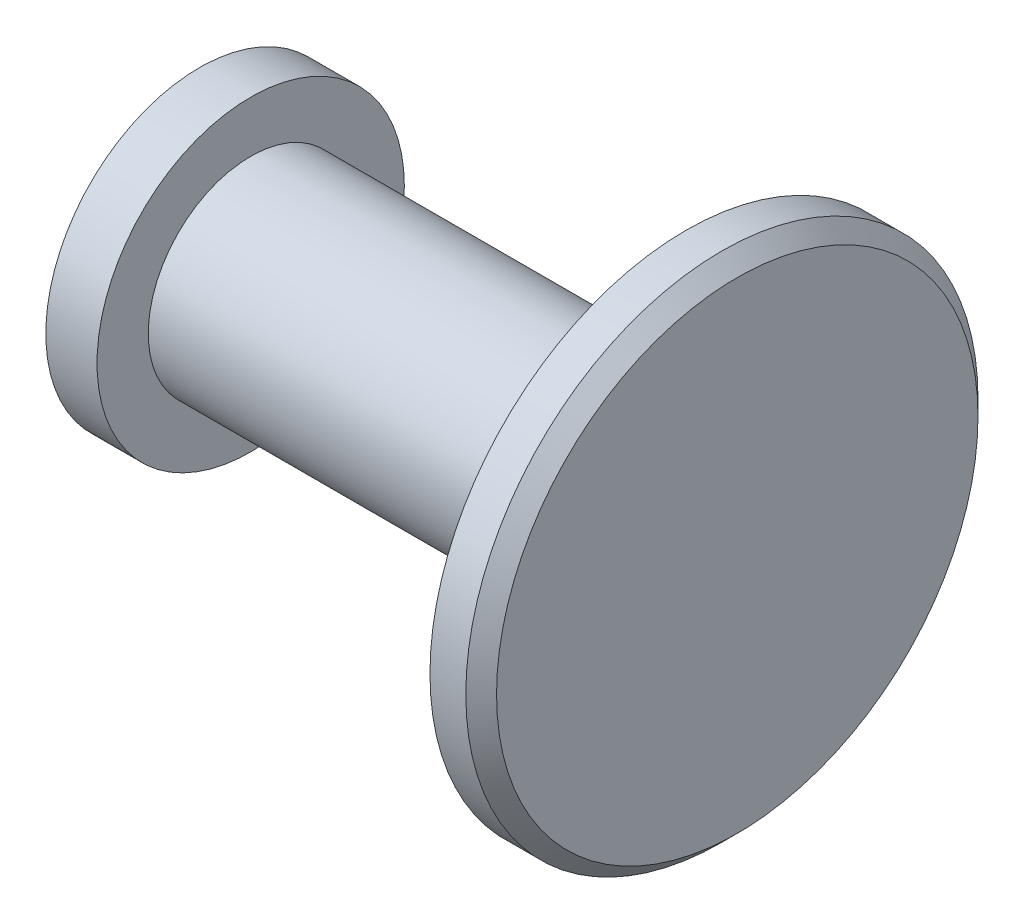
ISO-10303-21;
HEADER;
FILE_DESCRIPTION(('STEP AP214'),'2;1');
FILE_NAME('part.step','',(''),(''),'','','');
FILE_SCHEMA(('AUTOMOTIVE_DESIGN { 1 0 10303 214 1 1 1 1 }'));
ENDSEC;
DATA;
#1=APPLICATION_CONTEXT('core data for automotive mechanical design processes');
#2=APPLICATION_PROTOCOL_DEFINITION('international standard','automotive_design',2000,#1);
#3=PRODUCT_CONTEXT('',#1,'mechanical');
#4=PRODUCT('Part','Part','',(#3));
#5=PRODUCT_RELATED_PRODUCT_CATEGORY('part','',(#4));
#6=PRODUCT_DEFINITION_FORMATION('','',#4);
#7=PRODUCT_DEFINITION_CONTEXT('part definition',#1,'design');
#8=PRODUCT_DEFINITION('design','',#6,#7);
#9=PRODUCT_DEFINITION_SHAPE('','',#8);
#10=(LENGTH_UNIT() NAMED_UNIT(*) SI_UNIT(.MILLI.,.METRE.));
#11=(NAMED_UNIT(*) PLANE_ANGLE_UNIT() SI_UNIT($,.RADIAN.));
#12=(NAMED_UNIT(*) SI_UNIT($,.STERADIAN.) SOLID_ANGLE_UNIT());
#13=UNCERTAINTY_MEASURE_WITH_UNIT(LENGTH_MEASURE(1.E-05),#10,'distance_accuracy_value','');
#14=(GEOMETRIC_REPRESENTATION_CONTEXT(3) GLOBAL_UNCERTAINTY_ASSIGNED_CONTEXT((#13)) GLOBAL_UNIT_ASSIGNED_CONTEXT((#10,
#11,#12)) REPRESENTATION_CONTEXT('',''));
#15=CARTESIAN_POINT('',(0.,0.,0.));
#16=DIRECTION('',(0.,0.,1.));
#17=DIRECTION('',(1.,0.,0.));
#18=AXIS2_PLACEMENT_3D('',#15,#16,#17);
#19=CARTESIAN_POINT('',(-5.25,0.,0.));
#20=DIRECTION('',(1.,0.,0.));
#21=DIRECTION('',(0.,0.,-1.));
#22=AXIS2_PLACEMENT_3D('',#19,#20,#21);
#23=PLANE('',#22);
#24=CARTESIAN_POINT('',(-5.25,0.,0.));
#25=DIRECTION('',(1.,0.,0.));
#26=DIRECTION('',(0.,0.,-1.));
#27=AXIS2_PLACEMENT_3D('',#24,#25,#26);
#28=CIRCLE('',#27,3.);
#29=CARTESIAN_POINT('',(-5.25,0.,-3.));
#30=VERTEX_POINT('',#29);
#31=EDGE_CURVE('E96',#30,#30,#28,.T.);
#32=ORIENTED_EDGE('',*,*,#31,.F.);
#33=EDGE_LOOP('',(#32));
#34=FACE_BOUND('',#33,.T.);
#35=ADVANCED_FACE('F15',(#34),#23,.F.);
#36=CARTESIAN_POINT('',(-5.775,0.,0.));
#37=DIRECTION('',(1.,0.,0.));
#38=DIRECTION('',(0.,0.,-1.));
#39=AXIS2_PLACEMENT_3D('',#36,#37,#38);
#40=CYLINDRICAL_SURFACE('',#39,3.);
#41=CARTESIAN_POINT('',(-4.25,0.,0.));
#42=DIRECTION('',(1.,0.,0.));
#43=DIRECTION('',(0.,0.,-1.));
#44=AXIS2_PLACEMENT_3D('',#41,#42,#43);
#45=CIRCLE('',#44,3.);
#46=CARTESIAN_POINT('',(-4.25,0.,-3.));
#47=VERTEX_POINT('',#46);
#48=EDGE_CURVE('E93',#47,#47,#45,.T.);
#49=ORIENTED_EDGE('',*,*,#48,.F.);
#50=EDGE_LOOP('',(#49));
#51=FACE_BOUND('',#50,.T.);
#52=ORIENTED_EDGE('',*,*,#31,.T.);
#53=EDGE_LOOP('',(#52));
#54=FACE_BOUND('',#53,.T.);
#55=ADVANCED_FACE('F100',(#51,#54),#40,.T.);
#56=CARTESIAN_POINT('',(-4.25,0.,0.));
#57=DIRECTION('',(1.,0.,0.));
#58=DIRECTION('',(0.,0.,-1.));
#59=AXIS2_PLACEMENT_3D('',#56,#57,#58);
#60=PLANE('',#59);
#61=CARTESIAN_POINT('',(-4.25,0.,0.));
#62=DIRECTION('',(1.,0.,0.));
#63=DIRECTION('',(0.,0.,-1.));
#64=AXIS2_PLACEMENT_3D('',#61,#62,#63);
#65=CIRCLE('',#64,2.);
#66=CARTESIAN_POINT('',(-4.25,0.,-2.));
#67=VERTEX_POINT('',#66);
#68=EDGE_CURVE('E87',#67,#67,#65,.T.);
#69=ORIENTED_EDGE('',*,*,#68,.F.);
#70=EDGE_LOOP('',(#69));
#71=FACE_BOUND('',#70,.T.);
#72=ORIENTED_EDGE('',*,*,#48,.T.);
#73=EDGE_LOOP('',(#72));
#74=FACE_BOUND('',#73,.T.);
#75=ADVANCED_FACE('F107',(#71,#74),#60,.T.);
#76=CARTESIAN_POINT('',(-5.775,0.,0.));
#77=DIRECTION('',(1.,0.,0.));
#78=DIRECTION('',(0.,0.,-1.));
#79=AXIS2_PLACEMENT_3D('',#76,#77,#78);
#80=CYLINDRICAL_SURFACE('',#79,2.);
#81=ORIENTED_EDGE('',*,*,#68,.T.);
#82=EDGE_LOOP('',(#81));
#83=FACE_BOUND('',#82,.T.);
#84=CARTESIAN_POINT('',(3.95,0.,0.));
#85=DIRECTION('',(1.,0.,0.));
#86=DIRECTION('',(0.,0.999899210224222,-0.0141975136195803));
#87=AXIS2_PLACEMENT_3D('',#84,#85,#86);
#88=CIRCLE('',#87,2.);
#89=CARTESIAN_POINT('',(3.95,1.99979842044844,-0.0283950272391606));
#90=VERTEX_POINT('',#89);
#91=EDGE_CURVE('E46',#90,#90,#88,.F.);
#92=ORIENTED_EDGE('',*,*,#91,.T.);
#93=EDGE_LOOP('',(#92));
#94=FACE_BOUND('',#93,.T.);
#95=ADVANCED_FACE('F75',(#83,#94),#80,.T.);
#96=CARTESIAN_POINT('',(3.95,0.,0.));
#97=DIRECTION('',(1.,0.,0.));
#98=DIRECTION('',(0.,0.999899210224221,-0.0141975136195803));
#99=AXIS2_PLACEMENT_3D('',#96,#97,#98);
#100=TOROIDAL_SURFACE('',#99,2.3,0.3);
#101=CARTESIAN_POINT('',(4.25,0.,0.));
#102=DIRECTION('',(-1.,0.,0.));
#103=DIRECTION('',(0.,-1.,0.));
#104=AXIS2_PLACEMENT_3D('',#101,#102,#103);
#105=CIRCLE('',#104,2.3);
#106=CARTESIAN_POINT('',(4.25,-2.3,0.));
#107=VERTEX_POINT('',#106);
#108=CARTESIAN_POINT('',(4.25,2.3,0.));
#109=VERTEX_POINT('',#108);
#110=EDGE_CURVE('E34',#107,#109,#105,.T.);
#111=ORIENTED_EDGE('',*,*,#110,.T.);
#112=CARTESIAN_POINT('',(4.25,2.3,0.));
#113=CARTESIAN_POINT('',(4.2500000000683,2.30000123245997,-0.0108849006610331));
#114=CARTESIAN_POINT('',(4.25000000003871,2.29992655541998,-0.0217700947751237));
#115=CARTESIAN_POINT('',(4.2499999996242,2.29943550715158,-0.0571485127848273));
#116=CARTESIAN_POINT('',(4.24999999884124,2.29870863734905,-0.0816380628221029));
#117=CARTESIAN_POINT('',(4.24999999628218,2.29647001402845,-0.130581036879056));
#118=CARTESIAN_POINT('',(4.24999999450607,2.29495825017588,-0.155034460418814));
#119=CARTESIAN_POINT('',(4.2499999896215,2.29071845068819,-0.209479046731449));
#120=CARTESIAN_POINT('',(4.24999998630098,2.28779106776337,-0.239454913412215));
#121=CARTESIAN_POINT('',(4.24999997861863,2.28076063632506,-0.299268552070307));
#122=CARTESIAN_POINT('',(4.2499999742568,2.27665757059415,-0.329106322018755));
#123=CARTESIAN_POINT('',(4.24999996470835,2.26728237079675,-0.388598143048853));
#124=CARTESIAN_POINT('',(4.24999995952172,2.26201022060202,-0.41825219159015));
#125=CARTESIAN_POINT('',(4.24999994852312,2.25030488623727,-0.47733062391415));
#126=CARTESIAN_POINT('',(4.24999994271115,2.24387168703553,-0.506755004718275));
#127=CARTESIAN_POINT('',(4.24999993064975,2.22985418439969,-0.565328671610632));
#128=CARTESIAN_POINT('',(4.24999992440033,2.2222698670396,-0.594477954366253));
#129=CARTESIAN_POINT('',(4.24999991163891,2.20596181176894,-0.652456376096717));
#130=CARTESIAN_POINT('',(4.2499999051269,2.1972380610409,-0.681285511466266));
#131=CARTESIAN_POINT('',(4.24999989200255,2.17866459240292,-0.738579095048813));
#132=CARTESIAN_POINT('',(4.24999988539021,2.16881486278253,-0.767043539465514));
#133=CARTESIAN_POINT('',(4.24999987221467,2.14800462957063,-0.823563757687523));
#134=CARTESIAN_POINT('',(4.24999986565148,2.13704411536943,-0.851619527586435));
#135=CARTESIAN_POINT('',(4.24999985271104,2.11402922498872,-0.907279045303013));
#136=CARTESIAN_POINT('',(4.24999984633379,2.10197483928938,-0.934882789184283));
#137=CARTESIAN_POINT('',(4.24999983388931,2.07679080988594,-0.989595601456222));
#138=CARTESIAN_POINT('',(4.24999982782207,2.06366115773643,-1.0167046659595));
#139=CARTESIAN_POINT('',(4.24999981610897,2.03634686278695,-1.07038623046394));
#140=CARTESIAN_POINT('',(4.2499998104631,2.02216221259601,-1.0969587267044));
#141=CARTESIAN_POINT('',(4.24999979969137,1.99275982089912,-1.1495260948634));
#142=CARTESIAN_POINT('',(4.24999979456551,1.97754207303227,-1.1755209632241));
#143=CARTESIAN_POINT('',(4.24999978491971,1.94609698342966,-1.22689290860154));
#144=CARTESIAN_POINT('',(4.24999978039978,1.92986963633438,-1.25226998233768));
#145=CARTESIAN_POINT('',(4.24999977203904,1.89643040746782,-1.30236712643903));
#146=CARTESIAN_POINT('',(4.24999976819824,1.87921852130545,-1.32708719387325));
#147=CARTESIAN_POINT('',(4.24999976125627,1.84383679646372,-1.37583212906357));
#148=CARTESIAN_POINT('',(4.24999975815509,1.82566695432465,-1.39985699430845));
#149=CARTESIAN_POINT('',(4.24999975274013,1.78839738151168,-1.44717440368182));
#150=CARTESIAN_POINT('',(4.24999975042635,1.76929764826847,-1.4704669457866));
#151=CARTESIAN_POINT('',(4.24999974662125,1.73019779561279,-1.51628371979455));
#152=CARTESIAN_POINT('',(4.24999974512992,1.71019767447654,-1.53880795022664));
#153=CARTESIAN_POINT('',(4.24999974299207,1.66932794111421,-1.58305329988624));
#154=CARTESIAN_POINT('',(4.24999974234554,1.64845832796129,-1.60477441825763));
#155=CARTESIAN_POINT('',(4.2499997419069,1.60588185053032,-1.64737998476326));
#156=CARTESIAN_POINT('',(4.24999974211479,1.58417498607026,-1.66826443271562));
#157=CARTESIAN_POINT('',(4.2499997433819,1.53995754096174,-1.70916439328425));
#158=CARTESIAN_POINT('',(4.24999974444112,1.51744696082059,-1.72917990644898));
#159=CARTESIAN_POINT('',(4.24999974739509,1.47165686233808,-1.76831107623482));
#160=CARTESIAN_POINT('',(4.24999974928983,1.44837734513463,-1.78742673418747));
#161=CARTESIAN_POINT('',(4.24999975388632,1.40108533971986,-1.82472866410779));
#162=CARTESIAN_POINT('',(4.24999975658806,1.37707285321531,-1.84291493823932));
#163=CARTESIAN_POINT('',(4.24999976275731,1.32835200990437,-1.87833000855978));
#164=CARTESIAN_POINT('',(4.24999976622482,1.30364365530899,-1.89555880779041));
#165=CARTESIAN_POINT('',(4.24999977387163,1.25356925258893,-1.92903231732445));
#166=CARTESIAN_POINT('',(4.24999977805093,1.22820320711224,-1.9452770315891));
#167=CARTESIAN_POINT('',(4.24999978705468,1.17685261635358,-1.97675728237337));
#168=CARTESIAN_POINT('',(4.24999979187912,1.1508680740869,-1.99199282381153));
#169=CARTESIAN_POINT('',(4.24999980209375,1.09832063973355,-2.02143120112517));
#170=CARTESIAN_POINT('',(4.24999980748393,1.07175775095752,-2.03563404291014));
#171=CARTESIAN_POINT('',(4.24999981873794,1.01809466765765,-2.06298509051678));
#172=CARTESIAN_POINT('',(4.24999982460177,0.99099447666583,-2.07613330326834));
#173=CARTESIAN_POINT('',(4.24999983669824,0.936298663543186,-2.10135479375278));
#174=CARTESIAN_POINT('',(4.24999984293089,0.908703045090012,-2.11342807946108));
#175=CARTESIAN_POINT('',(4.24999985564746,0.853059017317993,-2.136481079594));
#176=CARTESIAN_POINT('',(4.24999986213139,0.825010611745071,-2.14746080306031));
#177=CARTESIAN_POINT('',(4.24999987522028,0.76850434974536,-2.16830973393111));
#178=CARTESIAN_POINT('',(4.24999988182524,0.740046497054068,-2.1781789514598));
#179=CARTESIAN_POINT('',(4.24999989501322,0.682765313065499,-2.19679164387646));
#180=CARTESIAN_POINT('',(4.24999990159625,0.653941985413484,-2.20553512998283));
#181=CARTESIAN_POINT('',(4.24999991458467,0.595974389345059,-2.22188287284252));
#182=CARTESIAN_POINT('',(4.24999992099006,0.566830124402979,-2.22948714191552));
#183=CARTESIAN_POINT('',(4.24999993345485,0.508265682809231,-2.24354473172064));
#184=CARTESIAN_POINT('',(4.24999993951426,0.478845509379685,-2.24999806587606));
#185=CARTESIAN_POINT('',(4.24999995110579,0.419774721550022,-2.2617438265312));
#186=CARTESIAN_POINT('',(4.24999995663791,0.390124110037909,-2.26703626755578));
#187=CARTESIAN_POINT('',(4.24999996698172,0.330638212672522,-2.2764521553146));
#188=CARTESIAN_POINT('',(4.24999997179341,0.300802929292041,-2.28057561766723));
#189=CARTESIAN_POINT('',(4.24999998048724,0.240993961167781,-2.28764698226342));
#190=CARTESIAN_POINT('',(4.24999998436939,0.21102027839674,-2.2905949012111));
#191=CARTESIAN_POINT('',(4.24999999130318,0.148181820652376,-2.29553133517954));
#192=CARTESIAN_POINT('',(4.24999999424369,0.11530795506106,-2.29740482710212));
#193=CARTESIAN_POINT('',(4.249999998419,0.0495104185625147,-2.29973539086322));
#194=CARTESIAN_POINT('',(4.24999999965383,0.0165867485358092,-2.30019248745693));
#195=CARTESIAN_POINT('',(4.25000000018391,-0.0425182502266763,-2.2997526933082));
#196=CARTESIAN_POINT('',(4.24999999982409,-0.068701848769655,-2.29911351854955));
#197=CARTESIAN_POINT('',(4.25000000000469,-0.121032374009421,-2.29695752629792));
#198=CARTESIAN_POINT('',(4.25000000054508,-0.14717930162089,-2.29544073110018));
#199=CARTESIAN_POINT('',(4.2499999976321,-0.202092222337393,-2.29132785436487));
#200=CARTESIAN_POINT('',(4.24999999376247,-0.230851142477124,-2.28863685245651));
#201=CARTESIAN_POINT('',(4.24999997005639,-0.288249896951316,-2.28218923734545));
#202=CARTESIAN_POINT('',(4.24999995021971,-0.316889729454647,-2.27843260781836));
#203=CARTESIAN_POINT('',(4.24999987357325,-0.366488086911388,-2.27099460955025));
#204=CARTESIAN_POINT('',(4.24999982787734,-0.38748302210974,-2.26755400599857));
#205=CARTESIAN_POINT('',(4.24999972743048,-0.426380537683078,-2.26061964015322));
#206=CARTESIAN_POINT('',(4.24999967490176,-0.444296929067034,-2.25720350493843));
#207=CARTESIAN_POINT('',(4.24999959306341,-0.480038841046178,-2.24992717662052));
#208=CARTESIAN_POINT('',(4.24999956375344,-0.497864362963136,-2.24606698999585));
#209=CARTESIAN_POINT('',(4.2499995233935,-0.543776885724798,-2.23553178956783));
#210=CARTESIAN_POINT('',(4.24999953294427,-0.5717890329979,-2.22852754169599));
#211=CARTESIAN_POINT('',(4.24999961805794,-0.627513899516792,-2.21342693332052));
#212=CARTESIAN_POINT('',(4.24999969361389,-0.655226650043417,-2.20533068812375));
#213=CARTESIAN_POINT('',(4.24999982620881,-0.700493247258108,-2.19115659651306));
#214=CARTESIAN_POINT('',(4.24999988023924,-0.718144692518592,-2.1853889330988));
#215=CARTESIAN_POINT('',(4.2499999638449,-0.753283726011523,-2.17338131354944));
#216=CARTESIAN_POINT('',(4.24999999342309,-0.770771333859147,-2.16714141478545));
#217=CARTESIAN_POINT('',(4.25000000227871,-0.795579437137812,-2.15803308134342));
#218=CARTESIAN_POINT('',(4.25000000072521,-0.80294857711298,-2.15529509059334));
#219=CARTESIAN_POINT('',(4.24999999700043,-0.832467296157124,-2.14417145751427));
#220=CARTESIAN_POINT('',(4.24999999987882,-0.854513780952143,-2.13551013092199));
#221=CARTESIAN_POINT('',(4.24999999476801,-0.912005055475972,-2.11189318706636));
#222=CARTESIAN_POINT('',(4.24999997887521,-0.947224592659119,-2.09638290022754));
#223=CARTESIAN_POINT('',(4.24999993368386,-0.997359607063244,-2.07279596110859));
#224=CARTESIAN_POINT('',(4.24999991686483,-1.01260767060822,-2.06541678197683));
#225=CARTESIAN_POINT('',(4.24999987279481,-1.04455694691475,-2.04951935808923));
#226=CARTESIAN_POINT('',(4.24999984462203,-1.06123956237,-2.04096359846699));
#227=CARTESIAN_POINT('',(4.24999977913827,-1.09679355142649,-2.02217345891279));
#228=CARTESIAN_POINT('',(4.24999974109454,-1.11563141582716,-2.01187560240645));
#229=CARTESIAN_POINT('',(4.24999967553682,-1.15250464012899,-1.99103051028683));
#230=CARTESIAN_POINT('',(4.24999964776791,-1.17054797609576,-1.98049735802816));
#231=CARTESIAN_POINT('',(4.24999959287366,-1.21644556435529,-1.95284528934006));
#232=CARTESIAN_POINT('',(4.24999957497189,-1.24408462012023,-1.93536709790284));
#233=CARTESIAN_POINT('',(4.24999959498996,-1.29730679250396,-1.90006179478143));
#234=CARTESIAN_POINT('',(4.24999963035543,-1.32292577258383,-1.88228860457933));
#235=CARTESIAN_POINT('',(4.24999971458316,-1.37769874223958,-1.84260232970631));
#236=CARTESIAN_POINT('',(4.24999976471735,-1.40671485030622,-1.82049853701454));
#237=CARTESIAN_POINT('',(4.24999983539906,-1.46196304370169,-1.77631465266906));
#238=CARTESIAN_POINT('',(4.24999985754106,-1.48825771917485,-1.75431268710204));
#239=CARTESIAN_POINT('',(4.2499998919694,-1.53957615310443,-1.70939435514645));
#240=CARTESIAN_POINT('',(4.24999990435531,-1.56461024325566,-1.68648979926264));
#241=CARTESIAN_POINT('',(4.24999991912401,-1.61187495382755,-1.64129958411348));
#242=CARTESIAN_POINT('',(4.24999992216547,-1.63417738720981,-1.61908896491301));
#243=CARTESIAN_POINT('',(4.24999991990323,-1.6761582190321,-1.57554552591992));
#244=CARTESIAN_POINT('',(4.24999991523154,-1.6959056493561,-1.55427923042258));
#245=CARTESIAN_POINT('',(4.24999989685627,-1.73295543111499,-1.51285078237513));
#246=CARTESIAN_POINT('',(4.2499998839495,-1.75032336658977,-1.49274724207049));
#247=CARTESIAN_POINT('',(4.2499998385456,-1.78186866115614,-1.45495431451807));
#248=CARTESIAN_POINT('',(4.24999980920084,-1.79614024736819,-1.43734352133985));
#249=CARTESIAN_POINT('',(4.24999974809526,-1.81998504189005,-1.40701759563165));
#250=CARTESIAN_POINT('',(4.24999971965857,-1.82969133504906,-1.39440696177694));
#251=CARTESIAN_POINT('',(4.24999967145292,-1.84894238154222,-1.36883729441549));
#252=CARTESIAN_POINT('',(4.2499996517864,-1.85848403490673,-1.35587592851087));
#253=CARTESIAN_POINT('',(4.24999960693023,-1.88586371054852,-1.31783936689639));
#254=CARTESIAN_POINT('',(4.24999959306034,-1.9033320037443,-1.29249664939769));
#255=CARTESIAN_POINT('',(4.24999960261756,-1.93757163943943,-1.24058428384299));
#256=CARTESIAN_POINT('',(4.24999962682687,-1.9543209117194,-1.21400007794787));
#257=CARTESIAN_POINT('',(4.24999968623881,-1.98040415369338,-1.17062606630866));
#258=CARTESIAN_POINT('',(4.24999971350852,-1.99008944917969,-1.1540464865907));
#259=CARTESIAN_POINT('',(4.24999977457573,-2.00914830128264,-1.12044439668156));
#260=CARTESIAN_POINT('',(4.24999980844786,-2.0185167022143,-1.1034189571421));
#261=CARTESIAN_POINT('',(4.24999986239867,-2.03472916142526,-1.073046152667));
#262=CARTESIAN_POINT('',(4.24999988386121,-2.04166151661763,-1.05974581275739));
#263=CARTESIAN_POINT('',(4.24999991833231,-2.05500831971557,-1.03352413320732));
#264=CARTESIAN_POINT('',(4.24999993163228,-2.06143243605743,-1.02060770490598));
#265=CARTESIAN_POINT('',(4.24999996810202,-2.08244782190968,-0.977347315713661));
#266=CARTESIAN_POINT('',(4.24999998077062,-2.09650220708499,-0.94674013873047));
#267=CARTESIAN_POINT('',(4.24999999388528,-2.12184115245541,-0.888252095416547));
#268=CARTESIAN_POINT('',(4.24999999549356,-2.13326118905797,-0.860429713027621));
#269=CARTESIAN_POINT('',(4.24999999602631,-2.15130132963064,-0.813952929316027));
#270=CARTESIAN_POINT('',(4.24999999568046,-2.1582274292897,-0.79541679812455));
#271=CARTESIAN_POINT('',(4.24999999070198,-2.17095814606152,-0.760003526626781));
#272=CARTESIAN_POINT('',(4.24999998649313,-2.17680613053832,-0.743141990411003));
#273=CARTESIAN_POINT('',(4.24999997176797,-2.18732116760235,-0.711663408177273));
#274=CARTESIAN_POINT('',(4.24999996221898,-2.19203882013768,-0.697063215695406));
#275=CARTESIAN_POINT('',(4.24999993345678,-2.20520512183321,-0.654857516366038));
#276=CARTESIAN_POINT('',(4.24999991314477,-2.21327665793139,-0.627133266832306));
#277=CARTESIAN_POINT('',(4.24999987551788,-2.22836208229552,-0.571398585078466));
#278=CARTESIAN_POINT('',(4.24999985820308,-2.23537594297256,-0.543388145413579));
#279=CARTESIAN_POINT('',(4.24999983235223,-2.24833443549885,-0.487120384622129));
#280=CARTESIAN_POINT('',(4.24999982381631,-2.2542790531055,-0.458863060212252));
#281=CARTESIAN_POINT('',(4.24999981766787,-2.26509073277147,-0.402143064768614));
#282=CARTESIAN_POINT('',(4.24999982005536,-2.26995779422805,-0.373680393619998));
#283=CARTESIAN_POINT('',(4.24999983517891,-2.2786071756899,-0.31659104405115));
#284=CARTESIAN_POINT('',(4.24999984791485,-2.28238950892856,-0.287964367636083));
#285=CARTESIAN_POINT('',(4.24999988012869,-2.28886400480464,-0.230588724697414));
#286=CARTESIAN_POINT('',(4.24999989960643,-2.29155619465038,-0.201839761244011));
#287=CARTESIAN_POINT('',(4.24999993899644,-2.29584644509245,-0.144261400997459));
#288=CARTESIAN_POINT('',(4.24999995890869,-2.29744454695601,-0.1154320072792));
#289=CARTESIAN_POINT('',(4.24999998914743,-2.29954471156994,-0.0577347859683457));
#290=CARTESIAN_POINT('',(4.2499999994744,-2.30004682964656,-0.0288669603894428));
#291=CARTESIAN_POINT('',(4.25,-2.3,0.));
#292=B_SPLINE_CURVE_WITH_KNOTS('',3,(#112,#113,#114,#115,#116,#117,#118,#119,#120,#121,#122,
#123,#124,#125,#126,#127,#128,#129,#130,#131,#132,#133,#134,#135,#136,#137,#138,#139,#140,#141,
#142,#143,#144,#145,#146,#147,#148,#149,#150,#151,#152,#153,#154,#155,#156,#157,#158,#159,#160,
#161,#162,#163,#164,#165,#166,#167,#168,#169,#170,#171,#172,#173,#174,#175,#176,#177,#178,#179,
#180,#181,#182,#183,#184,#185,#186,#187,#188,#189,#190,#191,#192,#193,#194,#195,#196,#197,#198,
#199,#200,#201,#202,#203,#204,#205,#206,#207,#208,#209,#210,#211,#212,#213,#214,#215,#216,#217,
#218,#219,#220,#221,#222,#223,#224,#225,#226,#227,#228,#229,#230,#231,#232,#233,#234,#235,#236,
#237,#238,#239,#240,#241,#242,#243,#244,#245,#246,#247,#248,#249,#250,#251,#252,#253,#254,#255,
#256,#257,#258,#259,#260,#261,#262,#263,#264,#265,#266,#267,#268,#269,#270,#271,#272,#273,#274,
#275,#276,#277,#278,#279,#280,#281,#282,#283,#284,#285,#286,#287,#288,#289,#290,#291),
.UNSPECIFIED.,.F.,.F.,(4,2,2,2,2,2,2,2,2,2,2,2,2,2,2,2,2,2,2,2,2,2,2,2,2,2,2,2,2,2,2,2,2,2,2,2,
2,2,2,2,2,2,2,2,2,2,2,2,2,2,2,2,2,2,2,2,2,2,2,2,2,2,2,2,2,2,2,2,2,2,2,2,2,2,2,2,2,2,2,2,2,2,2,2,
2,2,2,2,2,4),(0.,0.0326551567985239,0.106142685197887,0.179631181213439,0.269962502305943,
0.360295146334503,0.450629036634624,0.540964096541808,0.631300249391551,0.721637418519352,
0.811975527260714,0.902314498951148,0.99265425692617,1.08299472452131,1.1733358250721,
1.26367748191409,1.35401961838283,1.4443621578139,1.53470502354286,1.62504813890529,
1.71539142723679,1.80573481187293,1.89607821614932,1.98642156340154,2.07676477696518,
2.16710778017585,2.25745049636911,2.34779284888055,2.43813476104573,2.52847615620023,
2.6188169576796,2.70915708881937,2.79949647295509,2.88983503342228,2.98017269355645,
3.07050937669312,3.16084500616779,3.25117950531596,3.34151279747314,3.43184480597483,
3.53059577686858,3.6293450218232,3.70790499885508,3.78646298022182,3.87309661807467,
3.95973158314355,4.02354892011961,4.07826079826834,4.13297187830494,4.21957222177756,
4.30616342804068,4.36186706758393,4.4175639506124,4.44114795956224,4.51219884294878,
4.62759263785428,4.67840909803863,4.73464910775189,4.79904661715825,4.86171797903797,
4.95978965463348,5.05330574444007,5.16269142274253,5.26551502171604,5.36727518088629,
5.46167590697571,5.54871836894823,5.62840344807503,5.69639634243168,5.74413346680495,
5.79241441847529,5.88472656216535,5.97895984631993,6.03655803992273,6.09484954169857,
6.1398423735246,6.18311783859051,6.2841217702423,6.37432415848197,6.43368188050905,
6.48721761259995,6.533245479292,6.61984862905177,6.7064540374196,6.79306059930907,
6.87966720964353,6.96627276335659,7.05287615539265,7.13947628070742,7.2260720342688),.UNSPECIFIED.);
#293=EDGE_CURVE('E32',#109,#107,#292,.T.);
#294=ORIENTED_EDGE('',*,*,#293,.T.);
#295=EDGE_LOOP('',(#111,#294));
#296=FACE_BOUND('',#295,.T.);
#297=ORIENTED_EDGE('',*,*,#91,.F.);
#298=EDGE_LOOP('',(#297));
#299=FACE_BOUND('',#298,.T.);
#300=ADVANCED_FACE('F36',(#296,#299),#100,.F.);
#301=CARTESIAN_POINT('',(4.25,0.,0.));
#302=DIRECTION('',(1.,0.,0.));
#303=DIRECTION('',(0.,0.,-1.));
#304=AXIS2_PLACEMENT_3D('',#301,#302,#303);
#305=PLANE('',#304);
#306=ORIENTED_EDGE('',*,*,#293,.F.);
#307=ORIENTED_EDGE('',*,*,#110,.F.);
#308=EDGE_LOOP('',(#306,#307));
#309=FACE_BOUND('',#308,.T.);
#310=CARTESIAN_POINT('',(4.25,0.,0.));
#311=DIRECTION('',(1.,0.,0.));
#312=DIRECTION('',(0.,0.,-1.));
#313=AXIS2_PLACEMENT_3D('',#310,#311,#312);
#314=CIRCLE('',#313,5.);
#315=CARTESIAN_POINT('',(4.25,0.,-5.));
#316=VERTEX_POINT('',#315);
#317=EDGE_CURVE('E40',#316,#316,#314,.T.);
#318=ORIENTED_EDGE('',*,*,#317,.F.);
#319=EDGE_LOOP('',(#318));
#320=FACE_BOUND('',#319,.T.);
#321=ADVANCED_FACE('F44',(#309,#320),#305,.F.);
#322=CARTESIAN_POINT('',(-5.775,0.,0.));
#323=DIRECTION('',(1.,0.,0.));
#324=DIRECTION('',(0.,0.,-1.));
#325=AXIS2_PLACEMENT_3D('',#322,#323,#324);
#326=CYLINDRICAL_SURFACE('',#325,5.);
#327=ORIENTED_EDGE('',*,*,#317,.T.);
#328=EDGE_LOOP('',(#327));
#329=FACE_BOUND('',#328,.T.);
#330=CARTESIAN_POINT('',(4.950000000008,0.,0.));
#331=DIRECTION('',(-1.,0.,0.));
#332=DIRECTION('',(0.,0.,-1.));
#333=AXIS2_PLACEMENT_3D('',#330,#331,#332);
#334=CIRCLE('',#333,4.99999999999545);
#335=CARTESIAN_POINT('',(4.950000000008,0.,-4.99999999999545));
#336=VERTEX_POINT('',#335);
#337=EDGE_CURVE('E26',#336,#336,#334,.F.);
#338=ORIENTED_EDGE('',*,*,#337,.F.);
#339=EDGE_LOOP('',(#338));
#340=FACE_BOUND('',#339,.T.);
#341=ADVANCED_FACE('F61',(#329,#340),#326,.T.);
#342=CARTESIAN_POINT('',(4.950000000008,0.,0.));
#343=DIRECTION('',(-1.,0.,0.));
#344=DIRECTION('',(0.,0.,1.));
#345=AXIS2_PLACEMENT_3D('',#342,#343,#344);
#346=CONICAL_SURFACE('',#345,4.99999999999545,0.785398163397448);
#347=CARTESIAN_POINT('',(5.24999999998954,0.,0.));
#348=DIRECTION('',(-1.,0.,0.));
#349=DIRECTION('',(0.,0.,1.));
#350=AXIS2_PLACEMENT_3D('',#347,#348,#349);
#351=CIRCLE('',#350,4.70000000001392);
#352=CARTESIAN_POINT('',(5.24999999998954,0.,4.70000000001392));
#353=VERTEX_POINT('',#352);
#354=EDGE_CURVE('E9',#353,#353,#351,.F.);
#355=ORIENTED_EDGE('',*,*,#354,.F.);
#356=EDGE_LOOP('',(#355));
#357=FACE_BOUND('',#356,.T.);
#358=ORIENTED_EDGE('',*,*,#337,.T.);
#359=EDGE_LOOP('',(#358));
#360=FACE_BOUND('',#359,.T.);
#361=ADVANCED_FACE('F111',(#357,#360),#346,.T.);
#362=CARTESIAN_POINT('',(5.25,0.,0.));
#363=DIRECTION('',(1.,0.,0.));
#364=DIRECTION('',(0.,0.,-1.));
#365=AXIS2_PLACEMENT_3D('',#362,#363,#364);
#366=PLANE('',#365);
#367=ORIENTED_EDGE('',*,*,#354,.T.);
#368=EDGE_LOOP('',(#367));
#369=FACE_BOUND('',#368,.T.);
#370=ADVANCED_FACE('F109',(#369),#366,.T.);
#371=CLOSED_SHELL('',(#35,#55,#75,#95,#300,#321,#341,#361,#370));
#372=MANIFOLD_SOLID_BREP('B1',#371);
#373=ADVANCED_BREP_SHAPE_REPRESENTATION('',(#18,#372),#14);
#374=SHAPE_DEFINITION_REPRESENTATION(#9,#373);
ENDSEC;
END-ISO-10303-21;
